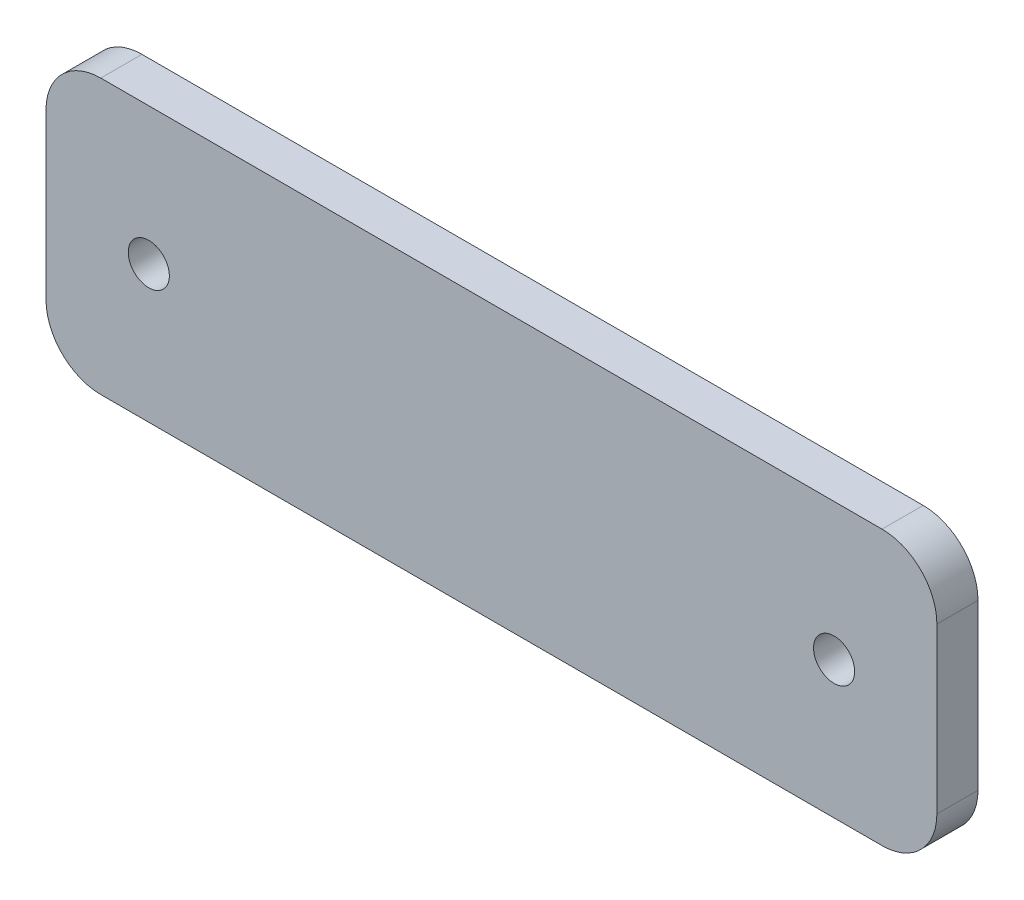
ISO-10303-21;
HEADER;
FILE_DESCRIPTION(('STEP AP214'),'2;1');
FILE_NAME('part.step','',(''),(''),'','','');
FILE_SCHEMA(('AUTOMOTIVE_DESIGN { 1 0 10303 214 1 1 1 1 }'));
ENDSEC;
DATA;
#1=APPLICATION_CONTEXT('core data for automotive mechanical design processes');
#2=APPLICATION_PROTOCOL_DEFINITION('international standard','automotive_design',2000,#1);
#3=PRODUCT_CONTEXT('',#1,'mechanical');
#4=PRODUCT('Part','Part','',(#3));
#5=PRODUCT_RELATED_PRODUCT_CATEGORY('part','',(#4));
#6=PRODUCT_DEFINITION_FORMATION('','',#4);
#7=PRODUCT_DEFINITION_CONTEXT('part definition',#1,'design');
#8=PRODUCT_DEFINITION('design','',#6,#7);
#9=PRODUCT_DEFINITION_SHAPE('','',#8);
#10=(LENGTH_UNIT() NAMED_UNIT(*) SI_UNIT(.MILLI.,.METRE.));
#11=(NAMED_UNIT(*) PLANE_ANGLE_UNIT() SI_UNIT($,.RADIAN.));
#12=(NAMED_UNIT(*) SI_UNIT($,.STERADIAN.) SOLID_ANGLE_UNIT());
#13=UNCERTAINTY_MEASURE_WITH_UNIT(LENGTH_MEASURE(1.E-05),#10,'distance_accuracy_value','');
#14=(GEOMETRIC_REPRESENTATION_CONTEXT(3) GLOBAL_UNCERTAINTY_ASSIGNED_CONTEXT((#13)) GLOBAL_UNIT_ASSIGNED_CONTEXT((#10,
#11,#12)) REPRESENTATION_CONTEXT('',''));
#15=CARTESIAN_POINT('',(0.,0.,0.));
#16=DIRECTION('',(0.,0.,1.));
#17=DIRECTION('',(1.,0.,0.));
#18=AXIS2_PLACEMENT_3D('',#15,#16,#17);
#19=CARTESIAN_POINT('',(-32.5,10.,3.));
#20=DIRECTION('',(1.,0.,0.));
#21=DIRECTION('',(0.,0.,-1.));
#22=AXIS2_PLACEMENT_3D('',#19,#20,#21);
#23=PLANE('',#22);
#24=DIRECTION('',(0.,-1.,0.));
#25=VECTOR('',#24,1.);
#26=CARTESIAN_POINT('',(-32.5,10.,0.));
#27=LINE('',#26,#25);
#28=CARTESIAN_POINT('',(-32.5,6.,0.));
#29=VERTEX_POINT('',#28);
#30=CARTESIAN_POINT('',(-32.5,-6.,0.));
#31=VERTEX_POINT('',#30);
#32=EDGE_CURVE('E144',#29,#31,#27,.T.);
#33=ORIENTED_EDGE('',*,*,#32,.T.);
#34=DIRECTION('',(0.,0.,-1.));
#35=VECTOR('',#34,1.);
#36=CARTESIAN_POINT('',(-32.5,-6.,3.));
#37=LINE('',#36,#35);
#38=CARTESIAN_POINT('',(-32.5,-6.,3.));
#39=VERTEX_POINT('',#38);
#40=EDGE_CURVE('E118',#31,#39,#37,.F.);
#41=ORIENTED_EDGE('',*,*,#40,.T.);
#42=DIRECTION('',(0.,-1.,0.));
#43=VECTOR('',#42,1.);
#44=CARTESIAN_POINT('',(-32.5,10.,3.));
#45=LINE('',#44,#43);
#46=CARTESIAN_POINT('',(-32.5,6.,3.));
#47=VERTEX_POINT('',#46);
#48=EDGE_CURVE('E157',#47,#39,#45,.T.);
#49=ORIENTED_EDGE('',*,*,#48,.F.);
#50=DIRECTION('',(0.,0.,-1.));
#51=VECTOR('',#50,1.);
#52=CARTESIAN_POINT('',(-32.5,6.,3.));
#53=LINE('',#52,#51);
#54=EDGE_CURVE('E124',#47,#29,#53,.T.);
#55=ORIENTED_EDGE('',*,*,#54,.T.);
#56=EDGE_LOOP('',(#33,#41,#49,#55));
#57=FACE_BOUND('',#56,.T.);
#58=ADVANCED_FACE('F45',(#57),#23,.F.);
#59=CARTESIAN_POINT('',(-32.5,-10.,3.));
#60=DIRECTION('',(0.,1.,0.));
#61=DIRECTION('',(0.,0.,1.));
#62=AXIS2_PLACEMENT_3D('',#59,#60,#61);
#63=PLANE('',#62);
#64=DIRECTION('',(1.,0.,0.));
#65=VECTOR('',#64,1.);
#66=CARTESIAN_POINT('',(-32.5,-10.,3.));
#67=LINE('',#66,#65);
#68=CARTESIAN_POINT('',(-28.5,-10.,3.));
#69=VERTEX_POINT('',#68);
#70=CARTESIAN_POINT('',(28.5,-10.,3.));
#71=VERTEX_POINT('',#70);
#72=EDGE_CURVE('E134',#69,#71,#67,.T.);
#73=ORIENTED_EDGE('',*,*,#72,.F.);
#74=DIRECTION('',(0.,0.,-1.));
#75=VECTOR('',#74,1.);
#76=CARTESIAN_POINT('',(-28.5,-10.,3.));
#77=LINE('',#76,#75);
#78=CARTESIAN_POINT('',(-28.5,-10.,0.));
#79=VERTEX_POINT('',#78);
#80=EDGE_CURVE('E117',#69,#79,#77,.T.);
#81=ORIENTED_EDGE('',*,*,#80,.T.);
#82=DIRECTION('',(1.,0.,0.));
#83=VECTOR('',#82,1.);
#84=CARTESIAN_POINT('',(-32.5,-10.,0.));
#85=LINE('',#84,#83);
#86=CARTESIAN_POINT('',(28.5,-10.,0.));
#87=VERTEX_POINT('',#86);
#88=EDGE_CURVE('E131',#79,#87,#85,.T.);
#89=ORIENTED_EDGE('',*,*,#88,.T.);
#90=DIRECTION('',(0.,0.,-1.));
#91=VECTOR('',#90,1.);
#92=CARTESIAN_POINT('',(28.5,-10.,3.));
#93=LINE('',#92,#91);
#94=EDGE_CURVE('E137',#87,#71,#93,.F.);
#95=ORIENTED_EDGE('',*,*,#94,.T.);
#96=EDGE_LOOP('',(#73,#81,#89,#95));
#97=FACE_BOUND('',#96,.T.);
#98=ADVANCED_FACE('F130',(#97),#63,.F.);
#99=CARTESIAN_POINT('',(32.5,10.,3.));
#100=DIRECTION('',(-1.,0.,0.));
#101=DIRECTION('',(0.,0.,1.));
#102=AXIS2_PLACEMENT_3D('',#99,#100,#101);
#103=PLANE('',#102);
#104=DIRECTION('',(0.,1.,0.));
#105=VECTOR('',#104,1.);
#106=CARTESIAN_POINT('',(32.5,10.,3.));
#107=LINE('',#106,#105);
#108=CARTESIAN_POINT('',(32.5,-6.,3.));
#109=VERTEX_POINT('',#108);
#110=CARTESIAN_POINT('',(32.5,6.,3.));
#111=VERTEX_POINT('',#110);
#112=EDGE_CURVE('E193',#109,#111,#107,.T.);
#113=ORIENTED_EDGE('',*,*,#112,.F.);
#114=DIRECTION('',(0.,0.,-1.));
#115=VECTOR('',#114,1.);
#116=CARTESIAN_POINT('',(32.5,-6.,3.));
#117=LINE('',#116,#115);
#118=CARTESIAN_POINT('',(32.5,-6.,0.));
#119=VERTEX_POINT('',#118);
#120=EDGE_CURVE('E11',#109,#119,#117,.T.);
#121=ORIENTED_EDGE('',*,*,#120,.T.);
#122=DIRECTION('',(0.,1.,0.));
#123=VECTOR('',#122,1.);
#124=CARTESIAN_POINT('',(32.5,10.,0.));
#125=LINE('',#124,#123);
#126=CARTESIAN_POINT('',(32.5,6.,0.));
#127=VERTEX_POINT('',#126);
#128=EDGE_CURVE('E143',#119,#127,#125,.T.);
#129=ORIENTED_EDGE('',*,*,#128,.T.);
#130=DIRECTION('',(0.,0.,-1.));
#131=VECTOR('',#130,1.);
#132=CARTESIAN_POINT('',(32.5,6.,3.));
#133=LINE('',#132,#131);
#134=EDGE_CURVE('E54',#127,#111,#133,.F.);
#135=ORIENTED_EDGE('',*,*,#134,.T.);
#136=EDGE_LOOP('',(#113,#121,#129,#135));
#137=FACE_BOUND('',#136,.T.);
#138=ADVANCED_FACE('F192',(#137),#103,.F.);
#139=CARTESIAN_POINT('',(-32.5,10.,3.));
#140=DIRECTION('',(0.,-1.,0.));
#141=DIRECTION('',(0.,0.,-1.));
#142=AXIS2_PLACEMENT_3D('',#139,#140,#141);
#143=PLANE('',#142);
#144=DIRECTION('',(-1.,0.,0.));
#145=VECTOR('',#144,1.);
#146=CARTESIAN_POINT('',(-32.5,10.,0.));
#147=LINE('',#146,#145);
#148=CARTESIAN_POINT('',(28.5,10.,0.));
#149=VERTEX_POINT('',#148);
#150=CARTESIAN_POINT('',(-28.5,10.,0.));
#151=VERTEX_POINT('',#150);
#152=EDGE_CURVE('E149',#149,#151,#147,.T.);
#153=ORIENTED_EDGE('',*,*,#152,.T.);
#154=DIRECTION('',(0.,0.,-1.));
#155=VECTOR('',#154,1.);
#156=CARTESIAN_POINT('',(-28.5,10.,3.));
#157=LINE('',#156,#155);
#158=CARTESIAN_POINT('',(-28.5,10.,3.));
#159=VERTEX_POINT('',#158);
#160=EDGE_CURVE('E61',#151,#159,#157,.F.);
#161=ORIENTED_EDGE('',*,*,#160,.T.);
#162=DIRECTION('',(-1.,0.,0.));
#163=VECTOR('',#162,1.);
#164=CARTESIAN_POINT('',(-32.5,10.,3.));
#165=LINE('',#164,#163);
#166=CARTESIAN_POINT('',(28.5,10.,3.));
#167=VERTEX_POINT('',#166);
#168=EDGE_CURVE('E159',#167,#159,#165,.T.);
#169=ORIENTED_EDGE('',*,*,#168,.F.);
#170=DIRECTION('',(0.,0.,-1.));
#171=VECTOR('',#170,1.);
#172=CARTESIAN_POINT('',(28.5,10.,3.));
#173=LINE('',#172,#171);
#174=EDGE_CURVE('E183',#167,#149,#173,.T.);
#175=ORIENTED_EDGE('',*,*,#174,.T.);
#176=EDGE_LOOP('',(#153,#161,#169,#175));
#177=FACE_BOUND('',#176,.T.);
#178=ADVANCED_FACE('F203',(#177),#143,.F.);
#179=CARTESIAN_POINT('',(0.,0.,3.));
#180=DIRECTION('',(0.,0.,1.));
#181=DIRECTION('',(1.,0.,0.));
#182=AXIS2_PLACEMENT_3D('',#179,#180,#181);
#183=PLANE('',#182);
#184=CARTESIAN_POINT('',(25.,0.,3.));
#185=DIRECTION('',(0.,0.,1.));
#186=DIRECTION('',(1.,0.,0.));
#187=AXIS2_PLACEMENT_3D('',#184,#185,#186);
#188=CIRCLE('',#187,1.5);
#189=CARTESIAN_POINT('',(26.5,0.,3.));
#190=VERTEX_POINT('',#189);
#191=EDGE_CURVE('E224',#190,#190,#188,.T.);
#192=ORIENTED_EDGE('',*,*,#191,.F.);
#193=EDGE_LOOP('',(#192));
#194=FACE_BOUND('',#193,.T.);
#195=CARTESIAN_POINT('',(-25.,0.,3.));
#196=DIRECTION('',(0.,0.,1.));
#197=DIRECTION('',(1.,0.,0.));
#198=AXIS2_PLACEMENT_3D('',#195,#196,#197);
#199=CIRCLE('',#198,1.5);
#200=CARTESIAN_POINT('',(-23.5,0.,3.));
#201=VERTEX_POINT('',#200);
#202=EDGE_CURVE('E220',#201,#201,#199,.T.);
#203=ORIENTED_EDGE('',*,*,#202,.F.);
#204=EDGE_LOOP('',(#203));
#205=FACE_BOUND('',#204,.T.);
#206=ORIENTED_EDGE('',*,*,#48,.T.);
#207=CARTESIAN_POINT('',(-28.5,-6.,3.));
#208=DIRECTION('',(0.,0.,1.));
#209=DIRECTION('',(1.,0.,0.));
#210=AXIS2_PLACEMENT_3D('',#207,#208,#209);
#211=CIRCLE('',#210,4.);
#212=EDGE_CURVE('E180',#39,#69,#211,.T.);
#213=ORIENTED_EDGE('',*,*,#212,.T.);
#214=ORIENTED_EDGE('',*,*,#72,.T.);
#215=CARTESIAN_POINT('',(28.5,-6.,3.));
#216=DIRECTION('',(0.,0.,1.));
#217=DIRECTION('',(1.,0.,0.));
#218=AXIS2_PLACEMENT_3D('',#215,#216,#217);
#219=CIRCLE('',#218,4.);
#220=EDGE_CURVE('E174',#71,#109,#219,.T.);
#221=ORIENTED_EDGE('',*,*,#220,.T.);
#222=ORIENTED_EDGE('',*,*,#112,.T.);
#223=CARTESIAN_POINT('',(28.5,6.,3.));
#224=DIRECTION('',(0.,0.,1.));
#225=DIRECTION('',(1.,0.,0.));
#226=AXIS2_PLACEMENT_3D('',#223,#224,#225);
#227=CIRCLE('',#226,4.);
#228=EDGE_CURVE('E68',#111,#167,#227,.T.);
#229=ORIENTED_EDGE('',*,*,#228,.T.);
#230=ORIENTED_EDGE('',*,*,#168,.T.);
#231=CARTESIAN_POINT('',(-28.5,6.,3.));
#232=DIRECTION('',(0.,0.,1.));
#233=DIRECTION('',(1.,0.,0.));
#234=AXIS2_PLACEMENT_3D('',#231,#232,#233);
#235=CIRCLE('',#234,4.);
#236=EDGE_CURVE('E177',#159,#47,#235,.T.);
#237=ORIENTED_EDGE('',*,*,#236,.T.);
#238=EDGE_LOOP('',(#206,#213,#214,#221,#222,#229,#230,#237));
#239=FACE_BOUND('',#238,.T.);
#240=ADVANCED_FACE('F197',(#194,#205,#239),#183,.T.);
#241=CARTESIAN_POINT('',(0.,0.,0.));
#242=DIRECTION('',(0.,0.,1.));
#243=DIRECTION('',(1.,0.,0.));
#244=AXIS2_PLACEMENT_3D('',#241,#242,#243);
#245=PLANE('',#244);
#246=CARTESIAN_POINT('',(25.,0.,0.));
#247=DIRECTION('',(0.,0.,1.));
#248=DIRECTION('',(1.,0.,0.));
#249=AXIS2_PLACEMENT_3D('',#246,#247,#248);
#250=CIRCLE('',#249,1.5);
#251=CARTESIAN_POINT('',(26.5,0.,0.));
#252=VERTEX_POINT('',#251);
#253=EDGE_CURVE('E151',#252,#252,#250,.T.);
#254=ORIENTED_EDGE('',*,*,#253,.T.);
#255=EDGE_LOOP('',(#254));
#256=FACE_BOUND('',#255,.T.);
#257=CARTESIAN_POINT('',(-25.,0.,0.));
#258=DIRECTION('',(0.,0.,1.));
#259=DIRECTION('',(1.,0.,0.));
#260=AXIS2_PLACEMENT_3D('',#257,#258,#259);
#261=CIRCLE('',#260,1.5);
#262=CARTESIAN_POINT('',(-23.5,0.,0.));
#263=VERTEX_POINT('',#262);
#264=EDGE_CURVE('E215',#263,#263,#261,.T.);
#265=ORIENTED_EDGE('',*,*,#264,.T.);
#266=EDGE_LOOP('',(#265));
#267=FACE_BOUND('',#266,.T.);
#268=ORIENTED_EDGE('',*,*,#88,.F.);
#269=CARTESIAN_POINT('',(-28.5,-6.,0.));
#270=DIRECTION('',(0.,0.,1.));
#271=DIRECTION('',(1.,0.,0.));
#272=AXIS2_PLACEMENT_3D('',#269,#270,#271);
#273=CIRCLE('',#272,4.);
#274=EDGE_CURVE('E113',#79,#31,#273,.F.);
#275=ORIENTED_EDGE('',*,*,#274,.T.);
#276=ORIENTED_EDGE('',*,*,#32,.F.);
#277=CARTESIAN_POINT('',(-28.5,6.,0.));
#278=DIRECTION('',(0.,0.,1.));
#279=DIRECTION('',(1.,0.,0.));
#280=AXIS2_PLACEMENT_3D('',#277,#278,#279);
#281=CIRCLE('',#280,4.);
#282=EDGE_CURVE('E125',#29,#151,#281,.F.);
#283=ORIENTED_EDGE('',*,*,#282,.T.);
#284=ORIENTED_EDGE('',*,*,#152,.F.);
#285=CARTESIAN_POINT('',(28.5,6.,0.));
#286=DIRECTION('',(0.,0.,1.));
#287=DIRECTION('',(1.,0.,0.));
#288=AXIS2_PLACEMENT_3D('',#285,#286,#287);
#289=CIRCLE('',#288,4.);
#290=EDGE_CURVE('E136',#149,#127,#289,.F.);
#291=ORIENTED_EDGE('',*,*,#290,.T.);
#292=ORIENTED_EDGE('',*,*,#128,.F.);
#293=CARTESIAN_POINT('',(28.5,-6.,0.));
#294=DIRECTION('',(0.,0.,1.));
#295=DIRECTION('',(1.,0.,0.));
#296=AXIS2_PLACEMENT_3D('',#293,#294,#295);
#297=CIRCLE('',#296,4.);
#298=EDGE_CURVE('E141',#119,#87,#297,.F.);
#299=ORIENTED_EDGE('',*,*,#298,.T.);
#300=EDGE_LOOP('',(#268,#275,#276,#283,#284,#291,#292,#299));
#301=FACE_BOUND('',#300,.T.);
#302=ADVANCED_FACE('F139',(#256,#267,#301),#245,.F.);
#303=CARTESIAN_POINT('',(-25.,0.,0.));
#304=DIRECTION('',(0.,0.,1.));
#305=DIRECTION('',(1.,0.,0.));
#306=AXIS2_PLACEMENT_3D('',#303,#304,#305);
#307=CYLINDRICAL_SURFACE('',#306,1.5);
#308=ORIENTED_EDGE('',*,*,#264,.F.);
#309=EDGE_LOOP('',(#308));
#310=FACE_BOUND('',#309,.T.);
#311=ORIENTED_EDGE('',*,*,#202,.T.);
#312=EDGE_LOOP('',(#311));
#313=FACE_BOUND('',#312,.T.);
#314=ADVANCED_FACE('F237',(#310,#313),#307,.F.);
#315=CARTESIAN_POINT('',(25.,0.,0.));
#316=DIRECTION('',(0.,0.,1.));
#317=DIRECTION('',(1.,0.,0.));
#318=AXIS2_PLACEMENT_3D('',#315,#316,#317);
#319=CYLINDRICAL_SURFACE('',#318,1.5);
#320=ORIENTED_EDGE('',*,*,#253,.F.);
#321=EDGE_LOOP('',(#320));
#322=FACE_BOUND('',#321,.T.);
#323=ORIENTED_EDGE('',*,*,#191,.T.);
#324=EDGE_LOOP('',(#323));
#325=FACE_BOUND('',#324,.T.);
#326=ADVANCED_FACE('F234',(#322,#325),#319,.F.);
#327=CARTESIAN_POINT('',(-28.5,-6.,3.));
#328=DIRECTION('',(0.,0.,-1.));
#329=DIRECTION('',(-1.,0.,0.));
#330=AXIS2_PLACEMENT_3D('',#327,#328,#329);
#331=CYLINDRICAL_SURFACE('',#330,4.);
#332=ORIENTED_EDGE('',*,*,#212,.F.);
#333=ORIENTED_EDGE('',*,*,#40,.F.);
#334=ORIENTED_EDGE('',*,*,#274,.F.);
#335=ORIENTED_EDGE('',*,*,#80,.F.);
#336=EDGE_LOOP('',(#332,#333,#334,#335));
#337=FACE_BOUND('',#336,.T.);
#338=ADVANCED_FACE('F116',(#337),#331,.T.);
#339=CARTESIAN_POINT('',(-28.5,6.,3.));
#340=DIRECTION('',(0.,0.,-1.));
#341=DIRECTION('',(-1.,0.,0.));
#342=AXIS2_PLACEMENT_3D('',#339,#340,#341);
#343=CYLINDRICAL_SURFACE('',#342,4.);
#344=ORIENTED_EDGE('',*,*,#236,.F.);
#345=ORIENTED_EDGE('',*,*,#160,.F.);
#346=ORIENTED_EDGE('',*,*,#282,.F.);
#347=ORIENTED_EDGE('',*,*,#54,.F.);
#348=EDGE_LOOP('',(#344,#345,#346,#347));
#349=FACE_BOUND('',#348,.T.);
#350=ADVANCED_FACE('F207',(#349),#343,.T.);
#351=CARTESIAN_POINT('',(28.5,-6.,3.));
#352=DIRECTION('',(0.,0.,-1.));
#353=DIRECTION('',(-1.,0.,0.));
#354=AXIS2_PLACEMENT_3D('',#351,#352,#353);
#355=CYLINDRICAL_SURFACE('',#354,4.);
#356=ORIENTED_EDGE('',*,*,#220,.F.);
#357=ORIENTED_EDGE('',*,*,#94,.F.);
#358=ORIENTED_EDGE('',*,*,#298,.F.);
#359=ORIENTED_EDGE('',*,*,#120,.F.);
#360=EDGE_LOOP('',(#356,#357,#358,#359));
#361=FACE_BOUND('',#360,.T.);
#362=ADVANCED_FACE('F265',(#361),#355,.T.);
#363=CARTESIAN_POINT('',(28.5,6.,3.));
#364=DIRECTION('',(0.,0.,-1.));
#365=DIRECTION('',(-1.,0.,0.));
#366=AXIS2_PLACEMENT_3D('',#363,#364,#365);
#367=CYLINDRICAL_SURFACE('',#366,4.);
#368=ORIENTED_EDGE('',*,*,#228,.F.);
#369=ORIENTED_EDGE('',*,*,#134,.F.);
#370=ORIENTED_EDGE('',*,*,#290,.F.);
#371=ORIENTED_EDGE('',*,*,#174,.F.);
#372=EDGE_LOOP('',(#368,#369,#370,#371));
#373=FACE_BOUND('',#372,.T.);
#374=ADVANCED_FACE('F47',(#373),#367,.T.);
#375=CLOSED_SHELL('',(#58,#98,#138,#178,#240,#302,#314,#326,#338,#350,#362,#374));
#376=MANIFOLD_SOLID_BREP('B2',#375);
#377=ADVANCED_BREP_SHAPE_REPRESENTATION('',(#18,#376),#14);
#378=SHAPE_DEFINITION_REPRESENTATION(#9,#377);
ENDSEC;
END-ISO-10303-21;
